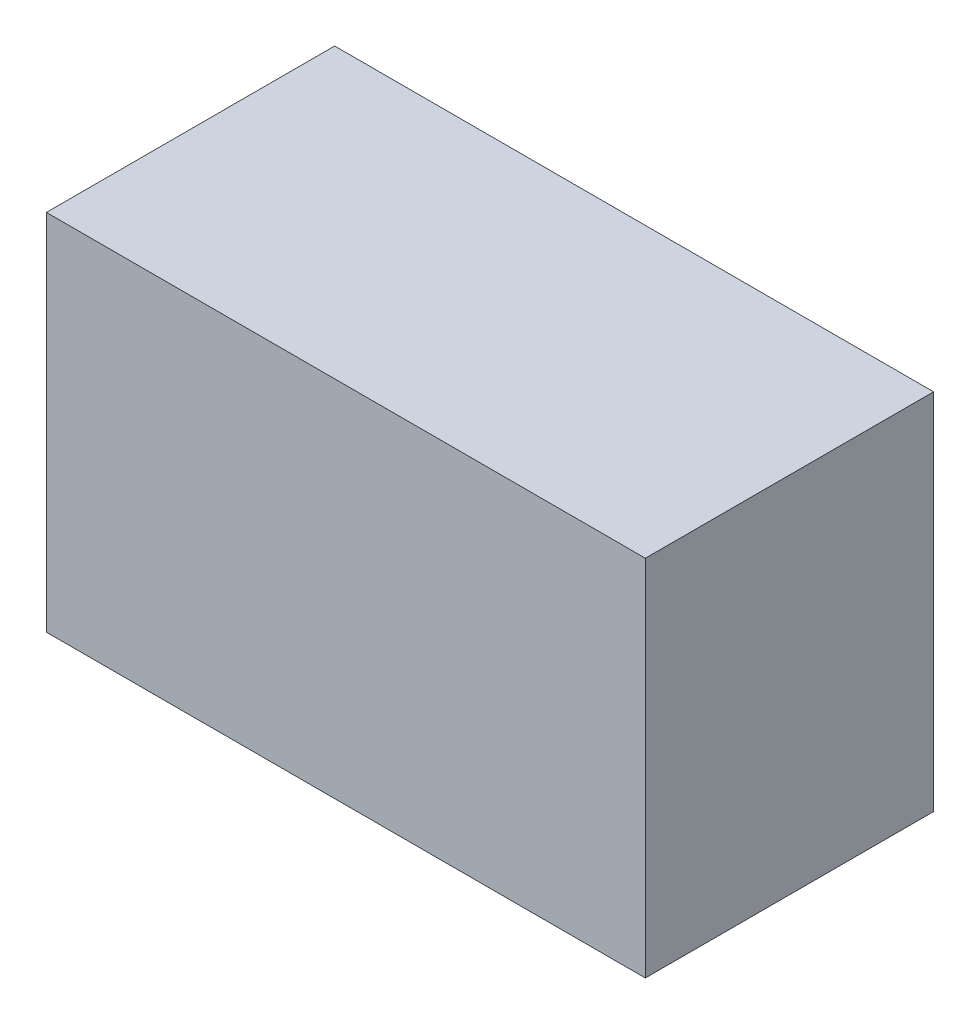
ISO-10303-21;
HEADER;
FILE_DESCRIPTION(('STEP AP214'),'2;1');
FILE_NAME('part.step','',(''),(''),'','','');
FILE_SCHEMA(('AUTOMOTIVE_DESIGN { 1 0 10303 214 1 1 1 1 }'));
ENDSEC;
DATA;
#1=APPLICATION_CONTEXT('core data for automotive mechanical design processes');
#2=APPLICATION_PROTOCOL_DEFINITION('international standard','automotive_design',2000,#1);
#3=PRODUCT_CONTEXT('',#1,'mechanical');
#4=PRODUCT('Part','Part','',(#3));
#5=PRODUCT_RELATED_PRODUCT_CATEGORY('part','',(#4));
#6=PRODUCT_DEFINITION_FORMATION('','',#4);
#7=PRODUCT_DEFINITION_CONTEXT('part definition',#1,'design');
#8=PRODUCT_DEFINITION('design','',#6,#7);
#9=PRODUCT_DEFINITION_SHAPE('','',#8);
#10=(LENGTH_UNIT() NAMED_UNIT(*) SI_UNIT(.MILLI.,.METRE.));
#11=(NAMED_UNIT(*) PLANE_ANGLE_UNIT() SI_UNIT($,.RADIAN.));
#12=(NAMED_UNIT(*) SI_UNIT($,.STERADIAN.) SOLID_ANGLE_UNIT());
#13=UNCERTAINTY_MEASURE_WITH_UNIT(LENGTH_MEASURE(1.E-05),#10,'distance_accuracy_value','');
#14=(GEOMETRIC_REPRESENTATION_CONTEXT(3) GLOBAL_UNCERTAINTY_ASSIGNED_CONTEXT((#13)) GLOBAL_UNIT_ASSIGNED_CONTEXT((#10,
#11,#12)) REPRESENTATION_CONTEXT('',''));
#15=CARTESIAN_POINT('',(0.,0.,0.));
#16=DIRECTION('',(0.,0.,1.));
#17=DIRECTION('',(1.,0.,0.));
#18=AXIS2_PLACEMENT_3D('',#15,#16,#17);
#19=CARTESIAN_POINT('',(-20.7797450477963,-12.6121473619632,12.));
#20=DIRECTION('',(1.,0.,0.));
#21=DIRECTION('',(0.,0.,-1.));
#22=AXIS2_PLACEMENT_3D('',#19,#20,#21);
#23=PLANE('',#22);
#24=DIRECTION('',(0.,-1.,0.));
#25=VECTOR('',#24,1.);
#26=CARTESIAN_POINT('',(-20.7797450477963,-12.6121473619632,-8.));
#27=LINE('',#26,#25);
#28=CARTESIAN_POINT('',(-20.7797450477963,12.6121473619632,-8.));
#29=VERTEX_POINT('',#28);
#30=CARTESIAN_POINT('',(-20.7797450477963,-12.6121473619632,-8.));
#31=VERTEX_POINT('',#30);
#32=EDGE_CURVE('E109',#29,#31,#27,.T.);
#33=ORIENTED_EDGE('',*,*,#32,.T.);
#34=DIRECTION('',(0.,0.,-1.));
#35=VECTOR('',#34,1.);
#36=CARTESIAN_POINT('',(-20.7797450477963,-12.6121473619632,12.));
#37=LINE('',#36,#35);
#38=CARTESIAN_POINT('',(-20.7797450477963,-12.6121473619632,12.));
#39=VERTEX_POINT('',#38);
#40=EDGE_CURVE('E12',#39,#31,#37,.T.);
#41=ORIENTED_EDGE('',*,*,#40,.F.);
#42=DIRECTION('',(0.,-1.,0.));
#43=VECTOR('',#42,1.);
#44=CARTESIAN_POINT('',(-20.7797450477963,-12.6121473619632,12.));
#45=LINE('',#44,#43);
#46=CARTESIAN_POINT('',(-20.7797450477963,12.6121473619632,12.));
#47=VERTEX_POINT('',#46);
#48=EDGE_CURVE('E97',#47,#39,#45,.T.);
#49=ORIENTED_EDGE('',*,*,#48,.F.);
#50=DIRECTION('',(0.,0.,-1.));
#51=VECTOR('',#50,1.);
#52=CARTESIAN_POINT('',(-20.7797450477963,12.6121473619632,12.));
#53=LINE('',#52,#51);
#54=EDGE_CURVE('E105',#47,#29,#53,.T.);
#55=ORIENTED_EDGE('',*,*,#54,.T.);
#56=EDGE_LOOP('',(#33,#41,#49,#55));
#57=FACE_BOUND('',#56,.T.);
#58=ADVANCED_FACE('F46',(#57),#23,.F.);
#59=CARTESIAN_POINT('',(20.7797450477963,-12.6121473619632,12.));
#60=DIRECTION('',(0.,1.,0.));
#61=DIRECTION('',(0.,0.,1.));
#62=AXIS2_PLACEMENT_3D('',#59,#60,#61);
#63=PLANE('',#62);
#64=DIRECTION('',(1.,0.,0.));
#65=VECTOR('',#64,1.);
#66=CARTESIAN_POINT('',(20.7797450477963,-12.6121473619632,-8.));
#67=LINE('',#66,#65);
#68=CARTESIAN_POINT('',(20.7797450477963,-12.6121473619632,-8.));
#69=VERTEX_POINT('',#68);
#70=EDGE_CURVE('E101',#31,#69,#67,.T.);
#71=ORIENTED_EDGE('',*,*,#70,.T.);
#72=DIRECTION('',(0.,0.,-1.));
#73=VECTOR('',#72,1.);
#74=CARTESIAN_POINT('',(20.7797450477963,-12.6121473619632,12.));
#75=LINE('',#74,#73);
#76=CARTESIAN_POINT('',(20.7797450477963,-12.6121473619632,12.));
#77=VERTEX_POINT('',#76);
#78=EDGE_CURVE('E54',#77,#69,#75,.T.);
#79=ORIENTED_EDGE('',*,*,#78,.F.);
#80=DIRECTION('',(1.,0.,0.));
#81=VECTOR('',#80,1.);
#82=CARTESIAN_POINT('',(20.7797450477963,-12.6121473619632,12.));
#83=LINE('',#82,#81);
#84=EDGE_CURVE('E92',#39,#77,#83,.T.);
#85=ORIENTED_EDGE('',*,*,#84,.F.);
#86=ORIENTED_EDGE('',*,*,#40,.T.);
#87=EDGE_LOOP('',(#71,#79,#85,#86));
#88=FACE_BOUND('',#87,.T.);
#89=ADVANCED_FACE('F100',(#88),#63,.F.);
#90=CARTESIAN_POINT('',(20.7797450477963,-12.6121473619632,12.));
#91=DIRECTION('',(-1.,0.,0.));
#92=DIRECTION('',(0.,0.,1.));
#93=AXIS2_PLACEMENT_3D('',#90,#91,#92);
#94=PLANE('',#93);
#95=DIRECTION('',(0.,1.,0.));
#96=VECTOR('',#95,1.);
#97=CARTESIAN_POINT('',(20.7797450477963,-12.6121473619632,-8.));
#98=LINE('',#97,#96);
#99=CARTESIAN_POINT('',(20.7797450477963,12.6121473619632,-8.));
#100=VERTEX_POINT('',#99);
#101=EDGE_CURVE('E79',#69,#100,#98,.T.);
#102=ORIENTED_EDGE('',*,*,#101,.T.);
#103=DIRECTION('',(0.,0.,-1.));
#104=VECTOR('',#103,1.);
#105=CARTESIAN_POINT('',(20.7797450477963,12.6121473619632,12.));
#106=LINE('',#105,#104);
#107=CARTESIAN_POINT('',(20.7797450477963,12.6121473619632,12.));
#108=VERTEX_POINT('',#107);
#109=EDGE_CURVE('E102',#108,#100,#106,.T.);
#110=ORIENTED_EDGE('',*,*,#109,.F.);
#111=DIRECTION('',(0.,1.,0.));
#112=VECTOR('',#111,1.);
#113=CARTESIAN_POINT('',(20.7797450477963,-12.6121473619632,12.));
#114=LINE('',#113,#112);
#115=EDGE_CURVE('E95',#77,#108,#114,.T.);
#116=ORIENTED_EDGE('',*,*,#115,.F.);
#117=ORIENTED_EDGE('',*,*,#78,.T.);
#118=EDGE_LOOP('',(#102,#110,#116,#117));
#119=FACE_BOUND('',#118,.T.);
#120=ADVANCED_FACE('F103',(#119),#94,.F.);
#121=CARTESIAN_POINT('',(20.7797450477963,12.6121473619632,12.));
#122=DIRECTION('',(0.,-1.,0.));
#123=DIRECTION('',(0.,0.,-1.));
#124=AXIS2_PLACEMENT_3D('',#121,#122,#123);
#125=PLANE('',#124);
#126=DIRECTION('',(-1.,0.,0.));
#127=VECTOR('',#126,1.);
#128=CARTESIAN_POINT('',(20.7797450477963,12.6121473619632,-8.));
#129=LINE('',#128,#127);
#130=EDGE_CURVE('E85',#100,#29,#129,.T.);
#131=ORIENTED_EDGE('',*,*,#130,.T.);
#132=ORIENTED_EDGE('',*,*,#54,.F.);
#133=DIRECTION('',(-1.,0.,0.));
#134=VECTOR('',#133,1.);
#135=CARTESIAN_POINT('',(20.7797450477963,12.6121473619632,12.));
#136=LINE('',#135,#134);
#137=EDGE_CURVE('E62',#108,#47,#136,.T.);
#138=ORIENTED_EDGE('',*,*,#137,.F.);
#139=ORIENTED_EDGE('',*,*,#109,.T.);
#140=EDGE_LOOP('',(#131,#132,#138,#139));
#141=FACE_BOUND('',#140,.T.);
#142=ADVANCED_FACE('F116',(#141),#125,.F.);
#143=CARTESIAN_POINT('',(0.,0.,12.));
#144=DIRECTION('',(0.,0.,1.));
#145=DIRECTION('',(1.,0.,0.));
#146=AXIS2_PLACEMENT_3D('',#143,#144,#145);
#147=PLANE('',#146);
#148=ORIENTED_EDGE('',*,*,#48,.T.);
#149=ORIENTED_EDGE('',*,*,#84,.T.);
#150=ORIENTED_EDGE('',*,*,#115,.T.);
#151=ORIENTED_EDGE('',*,*,#137,.T.);
#152=EDGE_LOOP('',(#148,#149,#150,#151));
#153=FACE_BOUND('',#152,.T.);
#154=ADVANCED_FACE('F93',(#153),#147,.T.);
#155=CARTESIAN_POINT('',(0.,0.,-8.));
#156=DIRECTION('',(0.,0.,1.));
#157=DIRECTION('',(1.,0.,0.));
#158=AXIS2_PLACEMENT_3D('',#155,#156,#157);
#159=PLANE('',#158);
#160=ORIENTED_EDGE('',*,*,#32,.F.);
#161=ORIENTED_EDGE('',*,*,#130,.F.);
#162=ORIENTED_EDGE('',*,*,#101,.F.);
#163=ORIENTED_EDGE('',*,*,#70,.F.);
#164=EDGE_LOOP('',(#160,#161,#162,#163));
#165=FACE_BOUND('',#164,.T.);
#166=ADVANCED_FACE('F119',(#165),#159,.F.);
#167=CLOSED_SHELL('',(#58,#89,#120,#142,#154,#166));
#168=MANIFOLD_SOLID_BREP('B2_NOT_SHOWN',#167);
#169=CARTESIAN_POINT('',(0.0576731087679194,-0.629813302217036,2.));
#170=DIRECTION('',(0.,0.,-1.));
#171=DIRECTION('',(-1.,0.,0.));
#172=AXIS2_PLACEMENT_3D('',#169,#170,#171);
#173=CYLINDRICAL_SURFACE('',#172,13.0443108638609);
#174=CARTESIAN_POINT('',(0.0576731087679194,-0.629813302217036,2.));
#175=DIRECTION('',(0.,0.,1.));
#176=DIRECTION('',(1.,0.,0.));
#177=AXIS2_PLACEMENT_3D('',#174,#175,#176);
#178=CIRCLE('',#177,13.0443108638609);
#179=CARTESIAN_POINT('',(13.1019839726288,-0.629813302217036,2.));
#180=VERTEX_POINT('',#179);
#181=EDGE_CURVE('E45',#180,#180,#178,.T.);
#182=ORIENTED_EDGE('',*,*,#181,.F.);
#183=EDGE_LOOP('',(#182));
#184=FACE_BOUND('',#183,.T.);
#185=CARTESIAN_POINT('',(0.0576731087679194,-0.629813302217036,0.));
#186=DIRECTION('',(0.,0.,1.));
#187=DIRECTION('',(1.,0.,0.));
#188=AXIS2_PLACEMENT_3D('',#185,#186,#187);
#189=CIRCLE('',#188,13.0443108638609);
#190=CARTESIAN_POINT('',(13.1019839726288,-0.629813302217036,0.));
#191=VERTEX_POINT('',#190);
#192=EDGE_CURVE('E184',#191,#191,#189,.T.);
#193=ORIENTED_EDGE('',*,*,#192,.T.);
#194=EDGE_LOOP('',(#193));
#195=FACE_BOUND('',#194,.T.);
#196=ADVANCED_FACE('F181',(#184,#195),#173,.T.);
#197=CARTESIAN_POINT('',(0.0576731087679194,-0.629813302217036,2.));
#198=DIRECTION('',(0.,0.,1.));
#199=DIRECTION('',(1.,0.,0.));
#200=AXIS2_PLACEMENT_3D('',#197,#198,#199);
#201=PLANE('',#200);
#202=ORIENTED_EDGE('',*,*,#181,.T.);
#203=EDGE_LOOP('',(#202));
#204=FACE_BOUND('',#203,.T.);
#205=ADVANCED_FACE('F196',(#204),#201,.T.);
#206=CARTESIAN_POINT('',(0.0576731087679194,-0.629813302217036,0.));
#207=DIRECTION('',(0.,0.,1.));
#208=DIRECTION('',(1.,0.,0.));
#209=AXIS2_PLACEMENT_3D('',#206,#207,#208);
#210=PLANE('',#209);
#211=ORIENTED_EDGE('',*,*,#192,.F.);
#212=EDGE_LOOP('',(#211));
#213=FACE_BOUND('',#212,.T.);
#214=ADVANCED_FACE('F194',(#213),#210,.F.);
#215=CLOSED_SHELL('',(#196,#205,#214));
#216=MANIFOLD_SOLID_BREP('B6',#215);
#217=ADVANCED_BREP_SHAPE_REPRESENTATION('',(#18,#168,#216),#14);
#218=SHAPE_DEFINITION_REPRESENTATION(#9,#217);
ENDSEC;
END-ISO-10303-21;
